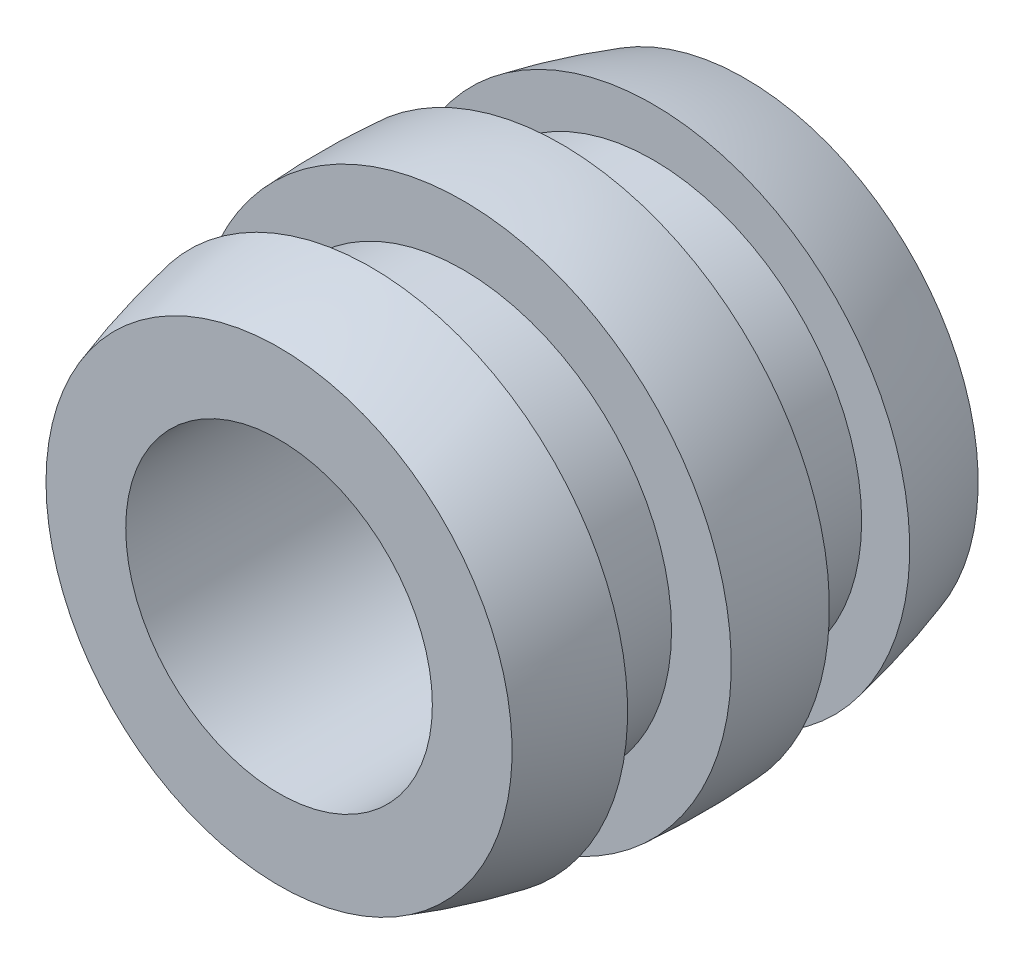
ISO-10303-21;
HEADER;
FILE_DESCRIPTION(('STEP AP214'),'2;1');
FILE_NAME('part.step','',(''),(''),'','','');
FILE_SCHEMA(('AUTOMOTIVE_DESIGN { 1 0 10303 214 1 1 1 1 }'));
ENDSEC;
DATA;
#1=APPLICATION_CONTEXT('core data for automotive mechanical design processes');
#2=APPLICATION_PROTOCOL_DEFINITION('international standard','automotive_design',2000,#1);
#3=PRODUCT_CONTEXT('',#1,'mechanical');
#4=PRODUCT('Part','Part','',(#3));
#5=PRODUCT_RELATED_PRODUCT_CATEGORY('part','',(#4));
#6=PRODUCT_DEFINITION_FORMATION('','',#4);
#7=PRODUCT_DEFINITION_CONTEXT('part definition',#1,'design');
#8=PRODUCT_DEFINITION('design','',#6,#7);
#9=PRODUCT_DEFINITION_SHAPE('','',#8);
#10=(LENGTH_UNIT() NAMED_UNIT(*) SI_UNIT(.MILLI.,.METRE.));
#11=(NAMED_UNIT(*) PLANE_ANGLE_UNIT() SI_UNIT($,.RADIAN.));
#12=(NAMED_UNIT(*) SI_UNIT($,.STERADIAN.) SOLID_ANGLE_UNIT());
#13=UNCERTAINTY_MEASURE_WITH_UNIT(LENGTH_MEASURE(1.E-05),#10,'distance_accuracy_value','');
#14=(GEOMETRIC_REPRESENTATION_CONTEXT(3) GLOBAL_UNCERTAINTY_ASSIGNED_CONTEXT((#13)) GLOBAL_UNIT_ASSIGNED_CONTEXT((#10,
#11,#12)) REPRESENTATION_CONTEXT('',''));
#15=CARTESIAN_POINT('',(0.,0.,0.));
#16=DIRECTION('',(0.,0.,1.));
#17=DIRECTION('',(1.,0.,0.));
#18=AXIS2_PLACEMENT_3D('',#15,#16,#17);
#19=CARTESIAN_POINT('',(0.,0.,-12.065));
#20=DIRECTION('',(0.,0.,-1.));
#21=DIRECTION('',(-1.,0.,0.));
#22=AXIS2_PLACEMENT_3D('',#19,#20,#21);
#23=PLANE('',#22);
#24=CARTESIAN_POINT('',(0.,0.,-12.065));
#25=DIRECTION('',(0.,0.,1.));
#26=DIRECTION('',(1.,0.,0.));
#27=AXIS2_PLACEMENT_3D('',#24,#25,#26);
#28=CIRCLE('',#27,7.9375);
#29=CARTESIAN_POINT('',(7.9375,0.,-12.065));
#30=VERTEX_POINT('',#29);
#31=EDGE_CURVE('E84',#30,#30,#28,.T.);
#32=ORIENTED_EDGE('',*,*,#31,.T.);
#33=EDGE_LOOP('',(#32));
#34=FACE_BOUND('',#33,.T.);
#35=CARTESIAN_POINT('',(0.,0.,-12.065));
#36=DIRECTION('',(0.,0.,-1.));
#37=DIRECTION('',(-1.,0.,0.));
#38=AXIS2_PLACEMENT_3D('',#35,#36,#37);
#39=CIRCLE('',#38,12.065);
#40=CARTESIAN_POINT('',(-12.065,0.,-12.065));
#41=VERTEX_POINT('',#40);
#42=EDGE_CURVE('E10',#41,#41,#39,.T.);
#43=ORIENTED_EDGE('',*,*,#42,.T.);
#44=EDGE_LOOP('',(#43));
#45=FACE_BOUND('',#44,.T.);
#46=ADVANCED_FACE('F37',(#34,#45),#23,.T.);
#47=CARTESIAN_POINT('',(0.,0.,0.));
#48=DIRECTION('',(0.,0.,-1.));
#49=DIRECTION('',(-1.,0.,0.));
#50=AXIS2_PLACEMENT_3D('',#47,#48,#49);
#51=DEGENERATE_TOROIDAL_SURFACE('',#50,25.1883333333332,39.1583333333332,.F.);
#52=CARTESIAN_POINT('',(0.,0.,-7.3025));
#53=DIRECTION('',(0.,0.,-1.));
#54=DIRECTION('',(-1.,0.,0.));
#55=AXIS2_PLACEMENT_3D('',#52,#53,#54);
#56=CIRCLE('',#55,13.2830659548969);
#57=CARTESIAN_POINT('',(-13.2830659548969,0.,-7.3025));
#58=VERTEX_POINT('',#57);
#59=EDGE_CURVE('E44',#58,#58,#56,.T.);
#60=ORIENTED_EDGE('',*,*,#59,.T.);
#61=EDGE_LOOP('',(#60));
#62=FACE_BOUND('',#61,.T.);
#63=ORIENTED_EDGE('',*,*,#42,.F.);
#64=EDGE_LOOP('',(#63));
#65=FACE_BOUND('',#64,.T.);
#66=ADVANCED_FACE('F146',(#62,#65),#51,.F.);
#67=CARTESIAN_POINT('',(0.,13.2830659548969,-7.3025));
#68=DIRECTION('',(0.,0.,1.));
#69=DIRECTION('',(1.,0.,0.));
#70=AXIS2_PLACEMENT_3D('',#67,#68,#69);
#71=PLANE('',#70);
#72=CARTESIAN_POINT('',(0.,0.,-7.3025));
#73=DIRECTION('',(0.,0.,-1.));
#74=DIRECTION('',(-1.,0.,0.));
#75=AXIS2_PLACEMENT_3D('',#72,#73,#74);
#76=CIRCLE('',#75,10.795);
#77=CARTESIAN_POINT('',(-10.795,0.,-7.3025));
#78=VERTEX_POINT('',#77);
#79=EDGE_CURVE('E49',#78,#78,#76,.T.);
#80=ORIENTED_EDGE('',*,*,#79,.T.);
#81=EDGE_LOOP('',(#80));
#82=FACE_BOUND('',#81,.T.);
#83=ORIENTED_EDGE('',*,*,#59,.F.);
#84=EDGE_LOOP('',(#83));
#85=FACE_BOUND('',#84,.T.);
#86=ADVANCED_FACE('F140',(#82,#85),#71,.T.);
#87=CARTESIAN_POINT('',(0.,0.,-12.065));
#88=DIRECTION('',(0.,0.,-1.));
#89=DIRECTION('',(-1.,0.,0.));
#90=AXIS2_PLACEMENT_3D('',#87,#88,#89);
#91=CYLINDRICAL_SURFACE('',#90,10.795);
#92=CARTESIAN_POINT('',(0.,0.,-2.54));
#93=DIRECTION('',(0.,0.,-1.));
#94=DIRECTION('',(-1.,0.,0.));
#95=AXIS2_PLACEMENT_3D('',#92,#93,#94);
#96=CIRCLE('',#95,10.795);
#97=CARTESIAN_POINT('',(-10.795,0.,-2.54));
#98=VERTEX_POINT('',#97);
#99=EDGE_CURVE('E54',#98,#98,#96,.T.);
#100=ORIENTED_EDGE('',*,*,#99,.T.);
#101=EDGE_LOOP('',(#100));
#102=FACE_BOUND('',#101,.T.);
#103=ORIENTED_EDGE('',*,*,#79,.F.);
#104=EDGE_LOOP('',(#103));
#105=FACE_BOUND('',#104,.T.);
#106=ADVANCED_FACE('F134',(#102,#105),#91,.T.);
#107=CARTESIAN_POINT('',(0.,10.795,-2.54));
#108=DIRECTION('',(0.,0.,-1.));
#109=DIRECTION('',(-1.,0.,0.));
#110=AXIS2_PLACEMENT_3D('',#107,#108,#109);
#111=PLANE('',#110);
#112=CARTESIAN_POINT('',(0.,0.,-2.54));
#113=DIRECTION('',(0.,0.,-1.));
#114=DIRECTION('',(-1.,0.,0.));
#115=AXIS2_PLACEMENT_3D('',#112,#113,#114);
#116=CIRCLE('',#115,13.8875347881102);
#117=CARTESIAN_POINT('',(-13.8875347881102,0.,-2.54));
#118=VERTEX_POINT('',#117);
#119=EDGE_CURVE('E60',#118,#118,#116,.T.);
#120=ORIENTED_EDGE('',*,*,#119,.T.);
#121=EDGE_LOOP('',(#120));
#122=FACE_BOUND('',#121,.T.);
#123=ORIENTED_EDGE('',*,*,#99,.F.);
#124=EDGE_LOOP('',(#123));
#125=FACE_BOUND('',#124,.T.);
#126=ADVANCED_FACE('F128',(#122,#125),#111,.T.);
#127=CARTESIAN_POINT('',(0.,0.,0.));
#128=DIRECTION('',(0.,0.,-1.));
#129=DIRECTION('',(-1.,0.,0.));
#130=AXIS2_PLACEMENT_3D('',#127,#128,#129);
#131=DEGENERATE_TOROIDAL_SURFACE('',#130,25.1883333333332,39.1583333333332,.F.);
#132=CARTESIAN_POINT('',(0.,0.,2.54));
#133=DIRECTION('',(0.,0.,-1.));
#134=DIRECTION('',(-1.,0.,0.));
#135=AXIS2_PLACEMENT_3D('',#132,#133,#134);
#136=CIRCLE('',#135,13.8875347881102);
#137=CARTESIAN_POINT('',(-13.8875347881102,0.,2.54));
#138=VERTEX_POINT('',#137);
#139=EDGE_CURVE('E64',#138,#138,#136,.T.);
#140=ORIENTED_EDGE('',*,*,#139,.T.);
#141=EDGE_LOOP('',(#140));
#142=FACE_BOUND('',#141,.T.);
#143=ORIENTED_EDGE('',*,*,#119,.F.);
#144=EDGE_LOOP('',(#143));
#145=FACE_BOUND('',#144,.T.);
#146=ADVANCED_FACE('F122',(#142,#145),#131,.F.);
#147=CARTESIAN_POINT('',(0.,10.795,2.54));
#148=DIRECTION('',(0.,0.,1.));
#149=DIRECTION('',(1.,0.,0.));
#150=AXIS2_PLACEMENT_3D('',#147,#148,#149);
#151=PLANE('',#150);
#152=CARTESIAN_POINT('',(0.,0.,2.54));
#153=DIRECTION('',(0.,0.,-1.));
#154=DIRECTION('',(-1.,0.,0.));
#155=AXIS2_PLACEMENT_3D('',#152,#153,#154);
#156=CIRCLE('',#155,10.795);
#157=CARTESIAN_POINT('',(-10.795,0.,2.54));
#158=VERTEX_POINT('',#157);
#159=EDGE_CURVE('E68',#158,#158,#156,.T.);
#160=ORIENTED_EDGE('',*,*,#159,.T.);
#161=EDGE_LOOP('',(#160));
#162=FACE_BOUND('',#161,.T.);
#163=ORIENTED_EDGE('',*,*,#139,.F.);
#164=EDGE_LOOP('',(#163));
#165=FACE_BOUND('',#164,.T.);
#166=ADVANCED_FACE('F116',(#162,#165),#151,.T.);
#167=CARTESIAN_POINT('',(0.,0.,-12.065));
#168=DIRECTION('',(0.,0.,-1.));
#169=DIRECTION('',(-1.,0.,0.));
#170=AXIS2_PLACEMENT_3D('',#167,#168,#169);
#171=CYLINDRICAL_SURFACE('',#170,10.795);
#172=CARTESIAN_POINT('',(0.,0.,7.3025));
#173=DIRECTION('',(0.,0.,-1.));
#174=DIRECTION('',(-1.,0.,0.));
#175=AXIS2_PLACEMENT_3D('',#172,#173,#174);
#176=CIRCLE('',#175,10.795);
#177=CARTESIAN_POINT('',(-10.795,0.,7.3025));
#178=VERTEX_POINT('',#177);
#179=EDGE_CURVE('E72',#178,#178,#176,.T.);
#180=ORIENTED_EDGE('',*,*,#179,.T.);
#181=EDGE_LOOP('',(#180));
#182=FACE_BOUND('',#181,.T.);
#183=ORIENTED_EDGE('',*,*,#159,.F.);
#184=EDGE_LOOP('',(#183));
#185=FACE_BOUND('',#184,.T.);
#186=ADVANCED_FACE('F110',(#182,#185),#171,.T.);
#187=CARTESIAN_POINT('',(0.,13.2830659548969,7.3025));
#188=DIRECTION('',(0.,0.,-1.));
#189=DIRECTION('',(-1.,0.,0.));
#190=AXIS2_PLACEMENT_3D('',#187,#188,#189);
#191=PLANE('',#190);
#192=CARTESIAN_POINT('',(0.,0.,7.3025));
#193=DIRECTION('',(0.,0.,-1.));
#194=DIRECTION('',(-1.,0.,0.));
#195=AXIS2_PLACEMENT_3D('',#192,#193,#194);
#196=CIRCLE('',#195,13.2830659548969);
#197=CARTESIAN_POINT('',(-13.2830659548969,0.,7.3025));
#198=VERTEX_POINT('',#197);
#199=EDGE_CURVE('E76',#198,#198,#196,.T.);
#200=ORIENTED_EDGE('',*,*,#199,.T.);
#201=EDGE_LOOP('',(#200));
#202=FACE_BOUND('',#201,.T.);
#203=ORIENTED_EDGE('',*,*,#179,.F.);
#204=EDGE_LOOP('',(#203));
#205=FACE_BOUND('',#204,.T.);
#206=ADVANCED_FACE('F104',(#202,#205),#191,.T.);
#207=CARTESIAN_POINT('',(0.,0.,0.));
#208=DIRECTION('',(0.,0.,-1.));
#209=DIRECTION('',(-1.,0.,0.));
#210=AXIS2_PLACEMENT_3D('',#207,#208,#209);
#211=DEGENERATE_TOROIDAL_SURFACE('',#210,25.1883333333332,39.1583333333332,.F.);
#212=CARTESIAN_POINT('',(0.,0.,12.065));
#213=DIRECTION('',(0.,0.,-1.));
#214=DIRECTION('',(-1.,0.,0.));
#215=AXIS2_PLACEMENT_3D('',#212,#213,#214);
#216=CIRCLE('',#215,12.065);
#217=CARTESIAN_POINT('',(-12.065,0.,12.065));
#218=VERTEX_POINT('',#217);
#219=EDGE_CURVE('E80',#218,#218,#216,.T.);
#220=ORIENTED_EDGE('',*,*,#219,.T.);
#221=EDGE_LOOP('',(#220));
#222=FACE_BOUND('',#221,.T.);
#223=ORIENTED_EDGE('',*,*,#199,.F.);
#224=EDGE_LOOP('',(#223));
#225=FACE_BOUND('',#224,.T.);
#226=ADVANCED_FACE('F98',(#222,#225),#211,.F.);
#227=CARTESIAN_POINT('',(0.,0.,12.065));
#228=DIRECTION('',(0.,0.,1.));
#229=DIRECTION('',(1.,0.,0.));
#230=AXIS2_PLACEMENT_3D('',#227,#228,#229);
#231=PLANE('',#230);
#232=CARTESIAN_POINT('',(0.,0.,12.065));
#233=DIRECTION('',(0.,0.,1.));
#234=DIRECTION('',(1.,0.,0.));
#235=AXIS2_PLACEMENT_3D('',#232,#233,#234);
#236=CIRCLE('',#235,7.9375);
#237=CARTESIAN_POINT('',(7.9375,0.,12.065));
#238=VERTEX_POINT('',#237);
#239=EDGE_CURVE('E88',#238,#238,#236,.T.);
#240=ORIENTED_EDGE('',*,*,#239,.F.);
#241=EDGE_LOOP('',(#240));
#242=FACE_BOUND('',#241,.T.);
#243=ORIENTED_EDGE('',*,*,#219,.F.);
#244=EDGE_LOOP('',(#243));
#245=FACE_BOUND('',#244,.T.);
#246=ADVANCED_FACE('F95',(#242,#245),#231,.T.);
#247=CARTESIAN_POINT('',(0.,0.,-12.065));
#248=DIRECTION('',(0.,0.,1.));
#249=DIRECTION('',(1.,0.,0.));
#250=AXIS2_PLACEMENT_3D('',#247,#248,#249);
#251=CYLINDRICAL_SURFACE('',#250,7.9375);
#252=CARTESIAN_POINT('',(7.9375,0.,-12.065));
#253=CARTESIAN_POINT('',(7.9375,0.,-11.8136458333333));
#254=CARTESIAN_POINT('',(7.9375,0.,-11.5622916666667));
#255=CARTESIAN_POINT('',(7.9375,0.,-11.0595833333333));
#256=CARTESIAN_POINT('',(7.9375,0.,-10.8082291666667));
#257=CARTESIAN_POINT('',(7.9375,0.,-10.3055208333333));
#258=CARTESIAN_POINT('',(7.9375,0.,-10.0541666666667));
#259=CARTESIAN_POINT('',(7.9375,0.,-9.55145833333333));
#260=CARTESIAN_POINT('',(7.9375,0.,-9.30010416666667));
#261=CARTESIAN_POINT('',(7.9375,0.,-8.79739583333333));
#262=CARTESIAN_POINT('',(7.9375,0.,-8.54604166666667));
#263=CARTESIAN_POINT('',(7.9375,0.,-8.04333333333333));
#264=CARTESIAN_POINT('',(7.9375,0.,-7.79197916666667));
#265=CARTESIAN_POINT('',(7.9375,0.,-7.28927083333333));
#266=CARTESIAN_POINT('',(7.9375,0.,-7.03791666666667));
#267=CARTESIAN_POINT('',(7.9375,0.,-6.53520833333334));
#268=CARTESIAN_POINT('',(7.9375,0.,-6.28385416666667));
#269=CARTESIAN_POINT('',(7.9375,0.,-5.78114583333334));
#270=CARTESIAN_POINT('',(7.9375,0.,-5.52979166666667));
#271=CARTESIAN_POINT('',(7.9375,0.,-5.02708333333333));
#272=CARTESIAN_POINT('',(7.9375,0.,-4.77572916666667));
#273=CARTESIAN_POINT('',(7.9375,0.,-4.27302083333333));
#274=CARTESIAN_POINT('',(7.9375,0.,-4.02166666666667));
#275=CARTESIAN_POINT('',(7.9375,0.,-3.51895833333333));
#276=CARTESIAN_POINT('',(7.9375,0.,-3.26760416666667));
#277=CARTESIAN_POINT('',(7.9375,0.,-2.76489583333333));
#278=CARTESIAN_POINT('',(7.9375,0.,-2.51354166666667));
#279=CARTESIAN_POINT('',(7.9375,0.,-2.01083333333334));
#280=CARTESIAN_POINT('',(7.9375,0.,-1.75947916666667));
#281=CARTESIAN_POINT('',(7.9375,0.,-1.25677083333333));
#282=CARTESIAN_POINT('',(7.9375,0.,-1.00541666666667));
#283=CARTESIAN_POINT('',(7.9375,0.,-0.502708333333335));
#284=CARTESIAN_POINT('',(7.9375,0.,-0.251354166666668));
#285=CARTESIAN_POINT('',(7.9375,0.,0.251354166666665));
#286=CARTESIAN_POINT('',(7.9375,0.,0.502708333333331));
#287=CARTESIAN_POINT('',(7.9375,0.,1.00541666666666));
#288=CARTESIAN_POINT('',(7.9375,0.,1.25677083333333));
#289=CARTESIAN_POINT('',(7.9375,0.,1.75947916666666));
#290=CARTESIAN_POINT('',(7.9375,0.,2.01083333333333));
#291=CARTESIAN_POINT('',(7.9375,0.,2.51354166666667));
#292=CARTESIAN_POINT('',(7.9375,0.,2.76489583333333));
#293=CARTESIAN_POINT('',(7.9375,0.,3.26760416666666));
#294=CARTESIAN_POINT('',(7.9375,0.,3.51895833333333));
#295=CARTESIAN_POINT('',(7.9375,0.,4.02166666666666));
#296=CARTESIAN_POINT('',(7.9375,0.,4.27302083333333));
#297=CARTESIAN_POINT('',(7.9375,0.,4.77572916666666));
#298=CARTESIAN_POINT('',(7.9375,0.,5.02708333333333));
#299=CARTESIAN_POINT('',(7.9375,0.,5.52979166666666));
#300=CARTESIAN_POINT('',(7.9375,0.,5.78114583333333));
#301=CARTESIAN_POINT('',(7.9375,0.,6.28385416666666));
#302=CARTESIAN_POINT('',(7.9375,0.,6.53520833333333));
#303=CARTESIAN_POINT('',(7.9375,0.,7.03791666666666));
#304=CARTESIAN_POINT('',(7.9375,0.,7.28927083333333));
#305=CARTESIAN_POINT('',(7.9375,0.,7.79197916666666));
#306=CARTESIAN_POINT('',(7.9375,0.,8.04333333333333));
#307=CARTESIAN_POINT('',(7.9375,0.,8.54604166666666));
#308=CARTESIAN_POINT('',(7.9375,0.,8.79739583333333));
#309=CARTESIAN_POINT('',(7.9375,0.,9.30010416666667));
#310=CARTESIAN_POINT('',(7.9375,0.,9.55145833333333));
#311=CARTESIAN_POINT('',(7.9375,0.,10.0541666666667));
#312=CARTESIAN_POINT('',(7.9375,0.,10.3055208333333));
#313=CARTESIAN_POINT('',(7.9375,0.,10.8082291666667));
#314=CARTESIAN_POINT('',(7.9375,0.,11.0595833333333));
#315=CARTESIAN_POINT('',(7.9375,0.,11.5622916666667));
#316=CARTESIAN_POINT('',(7.9375,0.,11.8136458333333));
#317=CARTESIAN_POINT('',(7.9375,0.,12.065));
#318=B_SPLINE_CURVE_WITH_KNOTS('',3,(#252,#253,#254,#255,#256,#257,#258,#259,#260,#261,#262,
#263,#264,#265,#266,#267,#268,#269,#270,#271,#272,#273,#274,#275,#276,#277,#278,#279,#280,#281,
#282,#283,#284,#285,#286,#287,#288,#289,#290,#291,#292,#293,#294,#295,#296,#297,#298,#299,#300,
#301,#302,#303,#304,#305,#306,#307,#308,#309,#310,#311,#312,#313,#314,#315,#316,#317),
.UNSPECIFIED.,.F.,.F.,(4,2,2,2,2,2,2,2,2,2,2,2,2,2,2,2,2,2,2,2,2,2,2,2,2,2,2,2,2,2,2,2,4),(0.,
0.7540625,1.508125,2.2621875,3.01625,3.7703125,4.524375,5.2784375,6.0325,6.7865625,7.540625,
8.2946875,9.04875,9.8028125,10.556875,11.3109375,12.065,12.8190625,13.573125,14.3271875,
15.08125,15.8353125,16.589375,17.3434375,18.0975,18.8515625,19.605625,20.3596875,21.11375,
21.8678125,22.621875,23.3759375,24.13),.UNSPECIFIED.);
#319=EDGE_CURVE('BSEAM93',#30,#238,#318,.T.);
#320=ORIENTED_EDGE('',*,*,#31,.F.);
#321=ORIENTED_EDGE('',*,*,#239,.T.);
#322=ORIENTED_EDGE('',*,*,#319,.T.);
#323=ORIENTED_EDGE('',*,*,#319,.F.);
#324=EDGE_LOOP('',(#320,#322,#321,#323));
#325=FACE_BOUND('',#324,.T.);
#326=ADVANCED_FACE('F93',(#325),#251,.F.);
#327=CLOSED_SHELL('',(#46,#66,#86,#106,#126,#146,#166,#186,#206,#226,#246,#326));
#328=MANIFOLD_SOLID_BREP('B2',#327);
#329=ADVANCED_BREP_SHAPE_REPRESENTATION('',(#18,#328),#14);
#330=SHAPE_DEFINITION_REPRESENTATION(#9,#329);
ENDSEC;
END-ISO-10303-21;
